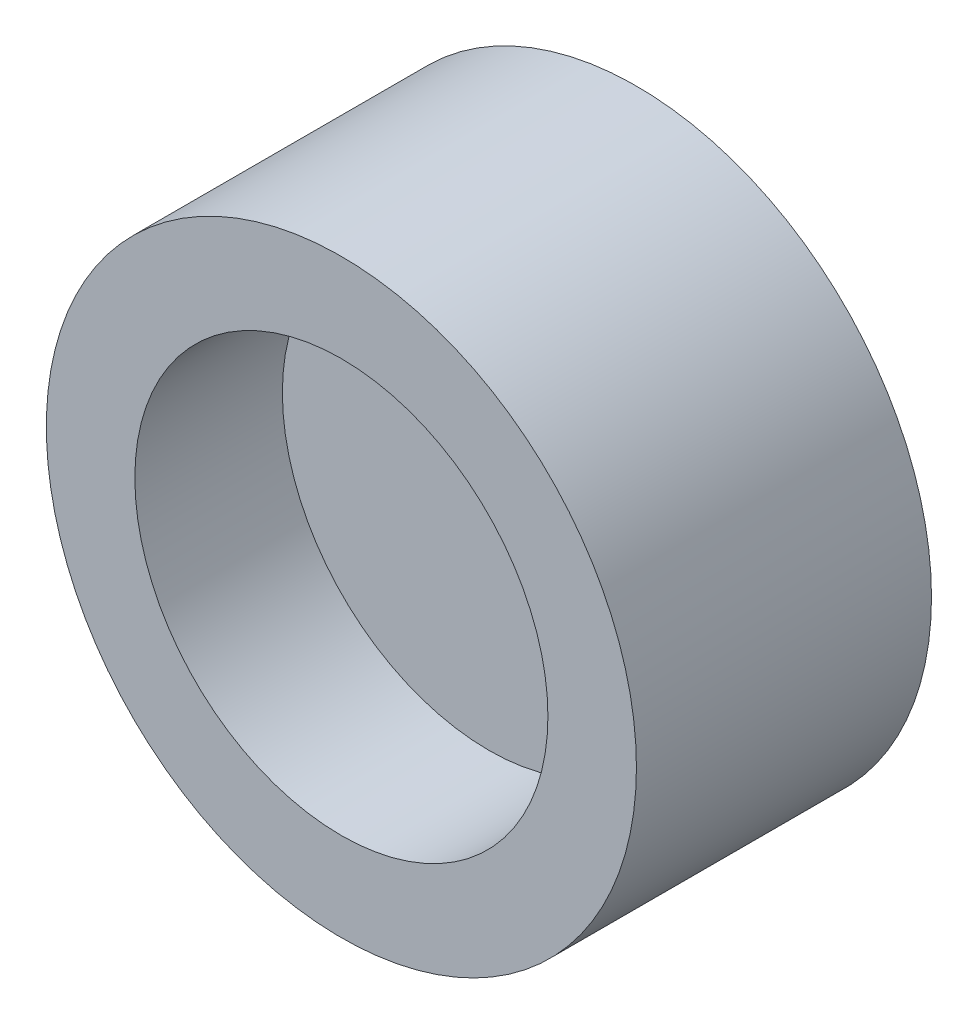
ISO-10303-21;
HEADER;
FILE_DESCRIPTION(('STEP AP214'),'2;1');
FILE_NAME('part.step','',(''),(''),'','','');
FILE_SCHEMA(('AUTOMOTIVE_DESIGN { 1 0 10303 214 1 1 1 1 }'));
ENDSEC;
DATA;
#1=APPLICATION_CONTEXT('core data for automotive mechanical design processes');
#2=APPLICATION_PROTOCOL_DEFINITION('international standard','automotive_design',2000,#1);
#3=PRODUCT_CONTEXT('',#1,'mechanical');
#4=PRODUCT('Part','Part','',(#3));
#5=PRODUCT_RELATED_PRODUCT_CATEGORY('part','',(#4));
#6=PRODUCT_DEFINITION_FORMATION('','',#4);
#7=PRODUCT_DEFINITION_CONTEXT('part definition',#1,'design');
#8=PRODUCT_DEFINITION('design','',#6,#7);
#9=PRODUCT_DEFINITION_SHAPE('','',#8);
#10=(LENGTH_UNIT() NAMED_UNIT(*) SI_UNIT(.MILLI.,.METRE.));
#11=(NAMED_UNIT(*) PLANE_ANGLE_UNIT() SI_UNIT($,.RADIAN.));
#12=(NAMED_UNIT(*) SI_UNIT($,.STERADIAN.) SOLID_ANGLE_UNIT());
#13=UNCERTAINTY_MEASURE_WITH_UNIT(LENGTH_MEASURE(1.E-05),#10,'distance_accuracy_value','');
#14=(GEOMETRIC_REPRESENTATION_CONTEXT(3) GLOBAL_UNCERTAINTY_ASSIGNED_CONTEXT((#13)) GLOBAL_UNIT_ASSIGNED_CONTEXT((#10,
#11,#12)) REPRESENTATION_CONTEXT('',''));
#15=CARTESIAN_POINT('',(0.,0.,0.));
#16=DIRECTION('',(0.,0.,1.));
#17=DIRECTION('',(1.,0.,0.));
#18=AXIS2_PLACEMENT_3D('',#15,#16,#17);
#19=CARTESIAN_POINT('',(0.,0.,3.));
#20=DIRECTION('',(0.,0.,-1.));
#21=DIRECTION('',(-1.,0.,0.));
#22=AXIS2_PLACEMENT_3D('',#19,#20,#21);
#23=CYLINDRICAL_SURFACE('',#22,3.);
#24=CARTESIAN_POINT('',(0.,0.,3.));
#25=DIRECTION('',(0.,0.,1.));
#26=DIRECTION('',(1.,0.,0.));
#27=AXIS2_PLACEMENT_3D('',#24,#25,#26);
#28=CIRCLE('',#27,3.);
#29=CARTESIAN_POINT('',(3.,0.,3.));
#30=VERTEX_POINT('',#29);
#31=EDGE_CURVE('E10',#30,#30,#28,.T.);
#32=ORIENTED_EDGE('',*,*,#31,.F.);
#33=EDGE_LOOP('',(#32));
#34=FACE_BOUND('',#33,.T.);
#35=CARTESIAN_POINT('',(0.,0.,0.));
#36=DIRECTION('',(0.,0.,1.));
#37=DIRECTION('',(1.,0.,0.));
#38=AXIS2_PLACEMENT_3D('',#35,#36,#37);
#39=CIRCLE('',#38,3.);
#40=CARTESIAN_POINT('',(3.,0.,0.));
#41=VERTEX_POINT('',#40);
#42=EDGE_CURVE('E40',#41,#41,#39,.T.);
#43=ORIENTED_EDGE('',*,*,#42,.T.);
#44=EDGE_LOOP('',(#43));
#45=FACE_BOUND('',#44,.T.);
#46=ADVANCED_FACE('F37',(#34,#45),#23,.T.);
#47=CARTESIAN_POINT('',(0.,0.,3.));
#48=DIRECTION('',(0.,0.,1.));
#49=DIRECTION('',(1.,0.,0.));
#50=AXIS2_PLACEMENT_3D('',#47,#48,#49);
#51=PLANE('',#50);
#52=CARTESIAN_POINT('',(0.,0.,3.));
#53=DIRECTION('',(0.,0.,1.));
#54=DIRECTION('',(1.,0.,0.));
#55=AXIS2_PLACEMENT_3D('',#52,#53,#54);
#56=CIRCLE('',#55,2.1);
#57=CARTESIAN_POINT('',(2.1,0.,3.));
#58=VERTEX_POINT('',#57);
#59=EDGE_CURVE('E49',#58,#58,#56,.T.);
#60=ORIENTED_EDGE('',*,*,#59,.F.);
#61=EDGE_LOOP('',(#60));
#62=FACE_BOUND('',#61,.T.);
#63=ORIENTED_EDGE('',*,*,#31,.T.);
#64=EDGE_LOOP('',(#63));
#65=FACE_BOUND('',#64,.T.);
#66=ADVANCED_FACE('F64',(#62,#65),#51,.T.);
#67=CARTESIAN_POINT('',(0.,0.,0.));
#68=DIRECTION('',(0.,0.,1.));
#69=DIRECTION('',(1.,0.,0.));
#70=AXIS2_PLACEMENT_3D('',#67,#68,#69);
#71=PLANE('',#70);
#72=ORIENTED_EDGE('',*,*,#42,.F.);
#73=EDGE_LOOP('',(#72));
#74=FACE_BOUND('',#73,.T.);
#75=ADVANCED_FACE('F60',(#74),#71,.F.);
#76=CARTESIAN_POINT('',(0.,0.,1.5));
#77=DIRECTION('',(0.,0.,1.));
#78=DIRECTION('',(1.,0.,0.));
#79=AXIS2_PLACEMENT_3D('',#76,#77,#78);
#80=CYLINDRICAL_SURFACE('',#79,2.1);
#81=CARTESIAN_POINT('',(0.,0.,1.5));
#82=DIRECTION('',(0.,0.,1.));
#83=DIRECTION('',(1.,0.,0.));
#84=AXIS2_PLACEMENT_3D('',#81,#82,#83);
#85=CIRCLE('',#84,2.1);
#86=CARTESIAN_POINT('',(2.1,0.,1.5));
#87=VERTEX_POINT('',#86);
#88=EDGE_CURVE('E47',#87,#87,#85,.T.);
#89=ORIENTED_EDGE('',*,*,#88,.F.);
#90=EDGE_LOOP('',(#89));
#91=FACE_BOUND('',#90,.T.);
#92=ORIENTED_EDGE('',*,*,#59,.T.);
#93=EDGE_LOOP('',(#92));
#94=FACE_BOUND('',#93,.T.);
#95=ADVANCED_FACE('F57',(#91,#94),#80,.F.);
#96=CARTESIAN_POINT('',(0.,0.,1.5));
#97=DIRECTION('',(0.,0.,1.));
#98=DIRECTION('',(1.,0.,0.));
#99=AXIS2_PLACEMENT_3D('',#96,#97,#98);
#100=PLANE('',#99);
#101=ORIENTED_EDGE('',*,*,#88,.T.);
#102=EDGE_LOOP('',(#101));
#103=FACE_BOUND('',#102,.T.);
#104=ADVANCED_FACE('F55',(#103),#100,.T.);
#105=CLOSED_SHELL('',(#46,#66,#75,#95,#104));
#106=MANIFOLD_SOLID_BREP('B2',#105);
#107=ADVANCED_BREP_SHAPE_REPRESENTATION('',(#18,#106),#14);
#108=SHAPE_DEFINITION_REPRESENTATION(#9,#107);
ENDSEC;
END-ISO-10303-21;
